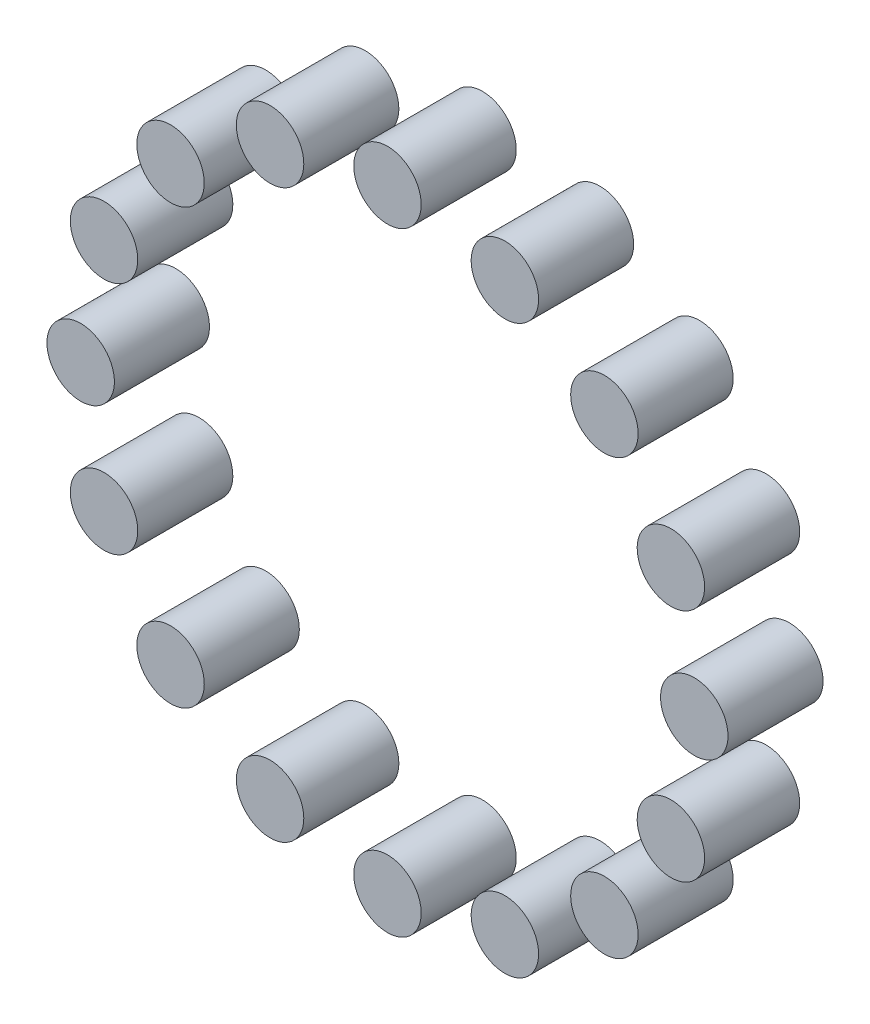
ISO-10303-21;
HEADER;
FILE_DESCRIPTION(('STEP AP214'),'2;1');
FILE_NAME('part.step','',(''),(''),'','','');
FILE_SCHEMA(('AUTOMOTIVE_DESIGN { 1 0 10303 214 1 1 1 1 }'));
ENDSEC;
DATA;
#1=APPLICATION_CONTEXT('core data for automotive mechanical design processes');
#2=APPLICATION_PROTOCOL_DEFINITION('international standard','automotive_design',2000,#1);
#3=PRODUCT_CONTEXT('',#1,'mechanical');
#4=PRODUCT('Part','Part','',(#3));
#5=PRODUCT_RELATED_PRODUCT_CATEGORY('part','',(#4));
#6=PRODUCT_DEFINITION_FORMATION('','',#4);
#7=PRODUCT_DEFINITION_CONTEXT('part definition',#1,'design');
#8=PRODUCT_DEFINITION('design','',#6,#7);
#9=PRODUCT_DEFINITION_SHAPE('','',#8);
#10=(LENGTH_UNIT() NAMED_UNIT(*) SI_UNIT(.MILLI.,.METRE.));
#11=(NAMED_UNIT(*) PLANE_ANGLE_UNIT() SI_UNIT($,.RADIAN.));
#12=(NAMED_UNIT(*) SI_UNIT($,.STERADIAN.) SOLID_ANGLE_UNIT());
#13=UNCERTAINTY_MEASURE_WITH_UNIT(LENGTH_MEASURE(1.E-05),#10,'distance_accuracy_value','');
#14=(GEOMETRIC_REPRESENTATION_CONTEXT(3) GLOBAL_UNCERTAINTY_ASSIGNED_CONTEXT((#13)) GLOBAL_UNIT_ASSIGNED_CONTEXT((#10,
#11,#12)) REPRESENTATION_CONTEXT('',''));
#15=CARTESIAN_POINT('',(0.,0.,0.));
#16=DIRECTION('',(0.,0.,1.));
#17=DIRECTION('',(1.,0.,0.));
#18=AXIS2_PLACEMENT_3D('',#15,#16,#17);
#19=CARTESIAN_POINT('',(29.8149783334382,-12.3497683875696,10.));
#20=DIRECTION('',(0.,0.,-1.));
#21=DIRECTION('',(-0.923879532511292,0.382683432365077,0.));
#22=AXIS2_PLACEMENT_3D('',#19,#20,#21);
#23=CYLINDRICAL_SURFACE('',#22,3.54796);
#24=CARTESIAN_POINT('',(29.8149783334382,-12.3497683875696,10.));
#25=DIRECTION('',(0.,0.,1.));
#26=DIRECTION('',(0.923879532511292,-0.382683432365077,0.));
#27=AXIS2_PLACEMENT_3D('',#24,#25,#26);
#28=CIRCLE('',#27,3.54796);
#29=CARTESIAN_POINT('',(33.0928659596069,-13.7075138982636,10.));
#30=VERTEX_POINT('',#29);
#31=EDGE_CURVE('E11',#30,#30,#28,.T.);
#32=ORIENTED_EDGE('',*,*,#31,.F.);
#33=EDGE_LOOP('',(#32));
#34=FACE_BOUND('',#33,.T.);
#35=CARTESIAN_POINT('',(29.8149783334382,-12.3497683875696,0.));
#36=DIRECTION('',(0.,0.,1.));
#37=DIRECTION('',(0.923879532511292,-0.382683432365077,0.));
#38=AXIS2_PLACEMENT_3D('',#35,#36,#37);
#39=CIRCLE('',#38,3.54796);
#40=CARTESIAN_POINT('',(33.0928659596069,-13.7075138982636,0.));
#41=VERTEX_POINT('',#40);
#42=EDGE_CURVE('E49',#41,#41,#39,.T.);
#43=ORIENTED_EDGE('',*,*,#42,.T.);
#44=EDGE_LOOP('',(#43));
#45=FACE_BOUND('',#44,.T.);
#46=ADVANCED_FACE('F46',(#34,#45),#23,.T.);
#47=CARTESIAN_POINT('',(29.8149783334382,-12.3497683875696,10.));
#48=DIRECTION('',(0.,0.,1.));
#49=DIRECTION('',(0.923879532511292,-0.382683432365077,0.));
#50=AXIS2_PLACEMENT_3D('',#47,#48,#49);
#51=PLANE('',#50);
#52=ORIENTED_EDGE('',*,*,#31,.T.);
#53=EDGE_LOOP('',(#52));
#54=FACE_BOUND('',#53,.T.);
#55=ADVANCED_FACE('F61',(#54),#51,.T.);
#56=CARTESIAN_POINT('',(29.8149783334382,-12.3497683875696,0.));
#57=DIRECTION('',(0.,0.,1.));
#58=DIRECTION('',(0.923879532511292,-0.382683432365077,0.));
#59=AXIS2_PLACEMENT_3D('',#56,#57,#58);
#60=PLANE('',#59);
#61=ORIENTED_EDGE('',*,*,#42,.F.);
#62=EDGE_LOOP('',(#61));
#63=FACE_BOUND('',#62,.T.);
#64=ADVANCED_FACE('F59',(#63),#60,.F.);
#65=CLOSED_SHELL('',(#46,#55,#64));
#66=MANIFOLD_SOLID_BREP('B2',#65);
#67=CARTESIAN_POINT('',(22.8193964890619,-22.8193964890614,10.));
#68=DIRECTION('',(0.,0.,-1.));
#69=DIRECTION('',(-0.707106781186556,0.707106781186539,0.));
#70=AXIS2_PLACEMENT_3D('',#67,#68,#69);
#71=CYLINDRICAL_SURFACE('',#70,3.54796);
#72=CARTESIAN_POINT('',(22.8193964890619,-22.8193964890614,10.));
#73=DIRECTION('',(0.,0.,1.));
#74=DIRECTION('',(0.707106781186556,-0.707106781186539,0.));
#75=AXIS2_PLACEMENT_3D('',#72,#73,#74);
#76=CIRCLE('',#75,3.54796);
#77=CARTESIAN_POINT('',(25.3281830644406,-25.32818306444,10.));
#78=VERTEX_POINT('',#77);
#79=EDGE_CURVE('E45',#78,#78,#76,.T.);
#80=ORIENTED_EDGE('',*,*,#79,.F.);
#81=EDGE_LOOP('',(#80));
#82=FACE_BOUND('',#81,.T.);
#83=CARTESIAN_POINT('',(22.8193964890619,-22.8193964890614,0.));
#84=DIRECTION('',(0.,0.,1.));
#85=DIRECTION('',(0.707106781186556,-0.707106781186539,0.));
#86=AXIS2_PLACEMENT_3D('',#83,#84,#85);
#87=CIRCLE('',#86,3.54796);
#88=CARTESIAN_POINT('',(25.3281830644406,-25.32818306444,0.));
#89=VERTEX_POINT('',#88);
#90=EDGE_CURVE('E104',#89,#89,#87,.T.);
#91=ORIENTED_EDGE('',*,*,#90,.T.);
#92=EDGE_LOOP('',(#91));
#93=FACE_BOUND('',#92,.T.);
#94=ADVANCED_FACE('F101',(#82,#93),#71,.T.);
#95=CARTESIAN_POINT('',(22.8193964890619,-22.8193964890614,10.));
#96=DIRECTION('',(0.,0.,1.));
#97=DIRECTION('',(0.707106781186556,-0.707106781186539,0.));
#98=AXIS2_PLACEMENT_3D('',#95,#96,#97);
#99=PLANE('',#98);
#100=ORIENTED_EDGE('',*,*,#79,.T.);
#101=EDGE_LOOP('',(#100));
#102=FACE_BOUND('',#101,.T.);
#103=ADVANCED_FACE('F116',(#102),#99,.T.);
#104=CARTESIAN_POINT('',(22.8193964890619,-22.8193964890614,0.));
#105=DIRECTION('',(0.,0.,1.));
#106=DIRECTION('',(0.707106781186556,-0.707106781186539,0.));
#107=AXIS2_PLACEMENT_3D('',#104,#105,#106);
#108=PLANE('',#107);
#109=ORIENTED_EDGE('',*,*,#90,.F.);
#110=EDGE_LOOP('',(#109));
#111=FACE_BOUND('',#110,.T.);
#112=ADVANCED_FACE('F114',(#111),#108,.F.);
#113=CLOSED_SHELL('',(#94,#103,#112));
#114=MANIFOLD_SOLID_BREP('B6',#113);
#115=CARTESIAN_POINT('',(12.3497683875703,-29.8149783334379,10.));
#116=DIRECTION('',(0.,0.,-1.));
#117=DIRECTION('',(-0.3826834323651,0.923879532511283,0.));
#118=AXIS2_PLACEMENT_3D('',#115,#116,#117);
#119=CYLINDRICAL_SURFACE('',#118,3.54796);
#120=CARTESIAN_POINT('',(12.3497683875703,-29.8149783334379,10.));
#121=DIRECTION('',(0.,0.,1.));
#122=DIRECTION('',(0.3826834323651,-0.923879532511283,0.));
#123=AXIS2_PLACEMENT_3D('',#120,#121,#122);
#124=CIRCLE('',#123,3.54796);
#125=CARTESIAN_POINT('',(13.7075138982644,-33.0928659596066,10.));
#126=VERTEX_POINT('',#125);
#127=EDGE_CURVE('E100',#126,#126,#124,.T.);
#128=ORIENTED_EDGE('',*,*,#127,.F.);
#129=EDGE_LOOP('',(#128));
#130=FACE_BOUND('',#129,.T.);
#131=CARTESIAN_POINT('',(12.3497683875703,-29.8149783334379,0.));
#132=DIRECTION('',(0.,0.,1.));
#133=DIRECTION('',(0.3826834323651,-0.923879532511283,0.));
#134=AXIS2_PLACEMENT_3D('',#131,#132,#133);
#135=CIRCLE('',#134,3.54796);
#136=CARTESIAN_POINT('',(13.7075138982644,-33.0928659596066,0.));
#137=VERTEX_POINT('',#136);
#138=EDGE_CURVE('E159',#137,#137,#135,.T.);
#139=ORIENTED_EDGE('',*,*,#138,.T.);
#140=EDGE_LOOP('',(#139));
#141=FACE_BOUND('',#140,.T.);
#142=ADVANCED_FACE('F156',(#130,#141),#119,.T.);
#143=CARTESIAN_POINT('',(12.3497683875703,-29.8149783334379,10.));
#144=DIRECTION('',(0.,0.,1.));
#145=DIRECTION('',(0.3826834323651,-0.923879532511283,0.));
#146=AXIS2_PLACEMENT_3D('',#143,#144,#145);
#147=PLANE('',#146);
#148=ORIENTED_EDGE('',*,*,#127,.T.);
#149=EDGE_LOOP('',(#148));
#150=FACE_BOUND('',#149,.T.);
#151=ADVANCED_FACE('F171',(#150),#147,.T.);
#152=CARTESIAN_POINT('',(12.3497683875703,-29.8149783334379,0.));
#153=DIRECTION('',(0.,0.,1.));
#154=DIRECTION('',(0.3826834323651,-0.923879532511283,0.));
#155=AXIS2_PLACEMENT_3D('',#152,#153,#154);
#156=PLANE('',#155);
#157=ORIENTED_EDGE('',*,*,#138,.F.);
#158=EDGE_LOOP('',(#157));
#159=FACE_BOUND('',#158,.T.);
#160=ADVANCED_FACE('F169',(#159),#156,.F.);
#161=CLOSED_SHELL('',(#142,#151,#160));
#162=MANIFOLD_SOLID_BREP('B40',#161);
#163=CARTESIAN_POINT('',(3.38026020079429E-13,-32.2715,10.));
#164=DIRECTION('',(0.,0.,-1.));
#165=DIRECTION('',(0.,1.,0.));
#166=AXIS2_PLACEMENT_3D('',#163,#164,#165);
#167=CYLINDRICAL_SURFACE('',#166,3.54796);
#168=CARTESIAN_POINT('',(3.38026020079429E-13,-32.2715,10.));
#169=DIRECTION('',(0.,0.,1.));
#170=DIRECTION('',(0.,-1.,0.));
#171=AXIS2_PLACEMENT_3D('',#168,#169,#170);
#172=CIRCLE('',#171,3.54796);
#173=CARTESIAN_POINT('',(3.75188928472314E-13,-35.81946,10.));
#174=VERTEX_POINT('',#173);
#175=EDGE_CURVE('E155',#174,#174,#172,.T.);
#176=ORIENTED_EDGE('',*,*,#175,.F.);
#177=EDGE_LOOP('',(#176));
#178=FACE_BOUND('',#177,.T.);
#179=CARTESIAN_POINT('',(3.38026020079429E-13,-32.2715,0.));
#180=DIRECTION('',(0.,0.,1.));
#181=DIRECTION('',(0.,-1.,0.));
#182=AXIS2_PLACEMENT_3D('',#179,#180,#181);
#183=CIRCLE('',#182,3.54796);
#184=CARTESIAN_POINT('',(3.75188928472314E-13,-35.81946,0.));
#185=VERTEX_POINT('',#184);
#186=EDGE_CURVE('E214',#185,#185,#183,.T.);
#187=ORIENTED_EDGE('',*,*,#186,.T.);
#188=EDGE_LOOP('',(#187));
#189=FACE_BOUND('',#188,.T.);
#190=ADVANCED_FACE('F211',(#178,#189),#167,.T.);
#191=CARTESIAN_POINT('',(3.38026020079429E-13,-32.2715,10.));
#192=DIRECTION('',(0.,0.,1.));
#193=DIRECTION('',(0.,-1.,0.));
#194=AXIS2_PLACEMENT_3D('',#191,#192,#193);
#195=PLANE('',#194);
#196=ORIENTED_EDGE('',*,*,#175,.T.);
#197=EDGE_LOOP('',(#196));
#198=FACE_BOUND('',#197,.T.);
#199=ADVANCED_FACE('F226',(#198),#195,.T.);
#200=CARTESIAN_POINT('',(3.38026020079429E-13,-32.2715,0.));
#201=DIRECTION('',(0.,0.,1.));
#202=DIRECTION('',(0.,-1.,0.));
#203=AXIS2_PLACEMENT_3D('',#200,#201,#202);
#204=PLANE('',#203);
#205=ORIENTED_EDGE('',*,*,#186,.F.);
#206=EDGE_LOOP('',(#205));
#207=FACE_BOUND('',#206,.T.);
#208=ADVANCED_FACE('F224',(#207),#204,.F.);
#209=CLOSED_SHELL('',(#190,#199,#208));
#210=MANIFOLD_SOLID_BREP('B95',#209);
#211=CARTESIAN_POINT('',(-12.3497683875697,-29.8149783334381,10.));
#212=DIRECTION('',(0.,0.,-1.));
#213=DIRECTION('',(0.382683432365081,0.923879532511291,0.));
#214=AXIS2_PLACEMENT_3D('',#211,#212,#213);
#215=CYLINDRICAL_SURFACE('',#214,3.54796);
#216=CARTESIAN_POINT('',(-12.3497683875697,-29.8149783334381,10.));
#217=DIRECTION('',(0.,0.,1.));
#218=DIRECTION('',(-0.382683432365081,-0.923879532511291,0.));
#219=AXIS2_PLACEMENT_3D('',#216,#217,#218);
#220=CIRCLE('',#219,3.54796);
#221=CARTESIAN_POINT('',(-13.7075138982637,-33.0928659596069,10.));
#222=VERTEX_POINT('',#221);
#223=EDGE_CURVE('E210',#222,#222,#220,.T.);
#224=ORIENTED_EDGE('',*,*,#223,.F.);
#225=EDGE_LOOP('',(#224));
#226=FACE_BOUND('',#225,.T.);
#227=CARTESIAN_POINT('',(-12.3497683875697,-29.8149783334381,0.));
#228=DIRECTION('',(0.,0.,1.));
#229=DIRECTION('',(-0.382683432365081,-0.923879532511291,0.));
#230=AXIS2_PLACEMENT_3D('',#227,#228,#229);
#231=CIRCLE('',#230,3.54796);
#232=CARTESIAN_POINT('',(-13.7075138982637,-33.0928659596069,0.));
#233=VERTEX_POINT('',#232);
#234=EDGE_CURVE('E269',#233,#233,#231,.T.);
#235=ORIENTED_EDGE('',*,*,#234,.T.);
#236=EDGE_LOOP('',(#235));
#237=FACE_BOUND('',#236,.T.);
#238=ADVANCED_FACE('F266',(#226,#237),#215,.T.);
#239=CARTESIAN_POINT('',(-12.3497683875697,-29.8149783334381,10.));
#240=DIRECTION('',(0.,0.,1.));
#241=DIRECTION('',(-0.382683432365081,-0.923879532511291,0.));
#242=AXIS2_PLACEMENT_3D('',#239,#240,#241);
#243=PLANE('',#242);
#244=ORIENTED_EDGE('',*,*,#223,.T.);
#245=EDGE_LOOP('',(#244));
#246=FACE_BOUND('',#245,.T.);
#247=ADVANCED_FACE('F281',(#246),#243,.T.);
#248=CARTESIAN_POINT('',(-12.3497683875697,-29.8149783334381,0.));
#249=DIRECTION('',(0.,0.,1.));
#250=DIRECTION('',(-0.382683432365081,-0.923879532511291,0.));
#251=AXIS2_PLACEMENT_3D('',#248,#249,#250);
#252=PLANE('',#251);
#253=ORIENTED_EDGE('',*,*,#234,.F.);
#254=EDGE_LOOP('',(#253));
#255=FACE_BOUND('',#254,.T.);
#256=ADVANCED_FACE('F279',(#255),#252,.F.);
#257=CLOSED_SHELL('',(#238,#247,#256));
#258=MANIFOLD_SOLID_BREP('B150',#257);
#259=CARTESIAN_POINT('',(-22.8193964890615,-22.8193964890619,10.));
#260=DIRECTION('',(0.,0.,-1.));
#261=DIRECTION('',(0.707106781186541,0.707106781186554,0.));
#262=AXIS2_PLACEMENT_3D('',#259,#260,#261);
#263=CYLINDRICAL_SURFACE('',#262,3.54796);
#264=CARTESIAN_POINT('',(-22.8193964890615,-22.8193964890619,10.));
#265=DIRECTION('',(0.,0.,1.));
#266=DIRECTION('',(-0.707106781186541,-0.707106781186554,0.));
#267=AXIS2_PLACEMENT_3D('',#264,#265,#266);
#268=CIRCLE('',#267,3.54796);
#269=CARTESIAN_POINT('',(-25.3281830644401,-25.3281830644405,10.));
#270=VERTEX_POINT('',#269);
#271=EDGE_CURVE('E265',#270,#270,#268,.T.);
#272=ORIENTED_EDGE('',*,*,#271,.F.);
#273=EDGE_LOOP('',(#272));
#274=FACE_BOUND('',#273,.T.);
#275=CARTESIAN_POINT('',(-22.8193964890615,-22.8193964890619,0.));
#276=DIRECTION('',(0.,0.,1.));
#277=DIRECTION('',(-0.707106781186541,-0.707106781186554,0.));
#278=AXIS2_PLACEMENT_3D('',#275,#276,#277);
#279=CIRCLE('',#278,3.54796);
#280=CARTESIAN_POINT('',(-25.3281830644401,-25.3281830644405,0.));
#281=VERTEX_POINT('',#280);
#282=EDGE_CURVE('E324',#281,#281,#279,.T.);
#283=ORIENTED_EDGE('',*,*,#282,.T.);
#284=EDGE_LOOP('',(#283));
#285=FACE_BOUND('',#284,.T.);
#286=ADVANCED_FACE('F321',(#274,#285),#263,.T.);
#287=CARTESIAN_POINT('',(-22.8193964890615,-22.8193964890619,10.));
#288=DIRECTION('',(0.,0.,1.));
#289=DIRECTION('',(-0.707106781186541,-0.707106781186554,0.));
#290=AXIS2_PLACEMENT_3D('',#287,#288,#289);
#291=PLANE('',#290);
#292=ORIENTED_EDGE('',*,*,#271,.T.);
#293=EDGE_LOOP('',(#292));
#294=FACE_BOUND('',#293,.T.);
#295=ADVANCED_FACE('F336',(#294),#291,.T.);
#296=CARTESIAN_POINT('',(-22.8193964890615,-22.8193964890619,0.));
#297=DIRECTION('',(0.,0.,1.));
#298=DIRECTION('',(-0.707106781186541,-0.707106781186554,0.));
#299=AXIS2_PLACEMENT_3D('',#296,#297,#298);
#300=PLANE('',#299);
#301=ORIENTED_EDGE('',*,*,#282,.F.);
#302=EDGE_LOOP('',(#301));
#303=FACE_BOUND('',#302,.T.);
#304=ADVANCED_FACE('F334',(#303),#300,.F.);
#305=CLOSED_SHELL('',(#286,#295,#304));
#306=MANIFOLD_SOLID_BREP('B205',#305);
#307=CARTESIAN_POINT('',(-29.8149783334379,-12.3497683875702,10.));
#308=DIRECTION('',(0.,0.,-1.));
#309=DIRECTION('',(0.923879532511284,0.382683432365097,0.));
#310=AXIS2_PLACEMENT_3D('',#307,#308,#309);
#311=CYLINDRICAL_SURFACE('',#310,3.54796);
#312=CARTESIAN_POINT('',(-29.8149783334379,-12.3497683875702,10.));
#313=DIRECTION('',(0.,0.,1.));
#314=DIRECTION('',(-0.923879532511284,-0.382683432365097,0.));
#315=AXIS2_PLACEMENT_3D('',#312,#313,#314);
#316=CIRCLE('',#315,3.54796);
#317=CARTESIAN_POINT('',(-33.0928659596066,-13.7075138982643,10.));
#318=VERTEX_POINT('',#317);
#319=EDGE_CURVE('E320',#318,#318,#316,.T.);
#320=ORIENTED_EDGE('',*,*,#319,.F.);
#321=EDGE_LOOP('',(#320));
#322=FACE_BOUND('',#321,.T.);
#323=CARTESIAN_POINT('',(-29.8149783334379,-12.3497683875702,0.));
#324=DIRECTION('',(0.,0.,1.));
#325=DIRECTION('',(-0.923879532511284,-0.382683432365097,0.));
#326=AXIS2_PLACEMENT_3D('',#323,#324,#325);
#327=CIRCLE('',#326,3.54796);
#328=CARTESIAN_POINT('',(-33.0928659596066,-13.7075138982643,0.));
#329=VERTEX_POINT('',#328);
#330=EDGE_CURVE('E379',#329,#329,#327,.T.);
#331=ORIENTED_EDGE('',*,*,#330,.T.);
#332=EDGE_LOOP('',(#331));
#333=FACE_BOUND('',#332,.T.);
#334=ADVANCED_FACE('F376',(#322,#333),#311,.T.);
#335=CARTESIAN_POINT('',(-29.8149783334379,-12.3497683875702,10.));
#336=DIRECTION('',(0.,0.,1.));
#337=DIRECTION('',(-0.923879532511284,-0.382683432365097,0.));
#338=AXIS2_PLACEMENT_3D('',#335,#336,#337);
#339=PLANE('',#338);
#340=ORIENTED_EDGE('',*,*,#319,.T.);
#341=EDGE_LOOP('',(#340));
#342=FACE_BOUND('',#341,.T.);
#343=ADVANCED_FACE('F391',(#342),#339,.T.);
#344=CARTESIAN_POINT('',(-29.8149783334379,-12.3497683875702,0.));
#345=DIRECTION('',(0.,0.,1.));
#346=DIRECTION('',(-0.923879532511284,-0.382683432365097,0.));
#347=AXIS2_PLACEMENT_3D('',#344,#345,#346);
#348=PLANE('',#347);
#349=ORIENTED_EDGE('',*,*,#330,.F.);
#350=EDGE_LOOP('',(#349));
#351=FACE_BOUND('',#350,.T.);
#352=ADVANCED_FACE('F389',(#351),#348,.F.);
#353=CLOSED_SHELL('',(#334,#343,#352));
#354=MANIFOLD_SOLID_BREP('B260',#353);
#355=CARTESIAN_POINT('',(-32.2715,0.,10.));
#356=DIRECTION('',(0.,0.,-1.));
#357=DIRECTION('',(1.,0.,0.));
#358=AXIS2_PLACEMENT_3D('',#355,#356,#357);
#359=CYLINDRICAL_SURFACE('',#358,3.54796);
#360=CARTESIAN_POINT('',(-32.2715,0.,10.));
#361=DIRECTION('',(0.,0.,1.));
#362=DIRECTION('',(-1.,0.,0.));
#363=AXIS2_PLACEMENT_3D('',#360,#361,#362);
#364=CIRCLE('',#363,3.54796);
#365=CARTESIAN_POINT('',(-35.81946,0.,10.));
#366=VERTEX_POINT('',#365);
#367=EDGE_CURVE('E375',#366,#366,#364,.T.);
#368=ORIENTED_EDGE('',*,*,#367,.F.);
#369=EDGE_LOOP('',(#368));
#370=FACE_BOUND('',#369,.T.);
#371=CARTESIAN_POINT('',(-32.2715,0.,0.));
#372=DIRECTION('',(0.,0.,1.));
#373=DIRECTION('',(-1.,0.,0.));
#374=AXIS2_PLACEMENT_3D('',#371,#372,#373);
#375=CIRCLE('',#374,3.54796);
#376=CARTESIAN_POINT('',(-35.81946,0.,0.));
#377=VERTEX_POINT('',#376);
#378=EDGE_CURVE('E434',#377,#377,#375,.T.);
#379=ORIENTED_EDGE('',*,*,#378,.T.);
#380=EDGE_LOOP('',(#379));
#381=FACE_BOUND('',#380,.T.);
#382=ADVANCED_FACE('F431',(#370,#381),#359,.T.);
#383=CARTESIAN_POINT('',(-32.2715,0.,10.));
#384=DIRECTION('',(0.,0.,1.));
#385=DIRECTION('',(-1.,0.,0.));
#386=AXIS2_PLACEMENT_3D('',#383,#384,#385);
#387=PLANE('',#386);
#388=ORIENTED_EDGE('',*,*,#367,.T.);
#389=EDGE_LOOP('',(#388));
#390=FACE_BOUND('',#389,.T.);
#391=ADVANCED_FACE('F446',(#390),#387,.T.);
#392=CARTESIAN_POINT('',(-32.2715,0.,0.));
#393=DIRECTION('',(0.,0.,1.));
#394=DIRECTION('',(-1.,0.,0.));
#395=AXIS2_PLACEMENT_3D('',#392,#393,#394);
#396=PLANE('',#395);
#397=ORIENTED_EDGE('',*,*,#378,.F.);
#398=EDGE_LOOP('',(#397));
#399=FACE_BOUND('',#398,.T.);
#400=ADVANCED_FACE('F444',(#399),#396,.F.);
#401=CLOSED_SHELL('',(#382,#391,#400));
#402=MANIFOLD_SOLID_BREP('B315',#401);
#403=CARTESIAN_POINT('',(-29.8149783334381,12.3497683875698,10.));
#404=DIRECTION('',(0.,0.,-1.));
#405=DIRECTION('',(0.923879532511289,-0.382683432365084,0.));
#406=AXIS2_PLACEMENT_3D('',#403,#404,#405);
#407=CYLINDRICAL_SURFACE('',#406,3.54796);
#408=CARTESIAN_POINT('',(-29.8149783334381,12.3497683875698,10.));
#409=DIRECTION('',(0.,0.,1.));
#410=DIRECTION('',(-0.923879532511289,0.382683432365084,0.));
#411=AXIS2_PLACEMENT_3D('',#408,#409,#410);
#412=CIRCLE('',#411,3.54796);
#413=CARTESIAN_POINT('',(-33.0928659596068,13.7075138982638,10.));
#414=VERTEX_POINT('',#413);
#415=EDGE_CURVE('E430',#414,#414,#412,.T.);
#416=ORIENTED_EDGE('',*,*,#415,.F.);
#417=EDGE_LOOP('',(#416));
#418=FACE_BOUND('',#417,.T.);
#419=CARTESIAN_POINT('',(-29.8149783334381,12.3497683875698,0.));
#420=DIRECTION('',(0.,0.,1.));
#421=DIRECTION('',(-0.923879532511289,0.382683432365084,0.));
#422=AXIS2_PLACEMENT_3D('',#419,#420,#421);
#423=CIRCLE('',#422,3.54796);
#424=CARTESIAN_POINT('',(-33.0928659596068,13.7075138982638,0.));
#425=VERTEX_POINT('',#424);
#426=EDGE_CURVE('E489',#425,#425,#423,.T.);
#427=ORIENTED_EDGE('',*,*,#426,.T.);
#428=EDGE_LOOP('',(#427));
#429=FACE_BOUND('',#428,.T.);
#430=ADVANCED_FACE('F486',(#418,#429),#407,.T.);
#431=CARTESIAN_POINT('',(-29.8149783334381,12.3497683875698,10.));
#432=DIRECTION('',(0.,0.,1.));
#433=DIRECTION('',(-0.923879532511289,0.382683432365084,0.));
#434=AXIS2_PLACEMENT_3D('',#431,#432,#433);
#435=PLANE('',#434);
#436=ORIENTED_EDGE('',*,*,#415,.T.);
#437=EDGE_LOOP('',(#436));
#438=FACE_BOUND('',#437,.T.);
#439=ADVANCED_FACE('F501',(#438),#435,.T.);
#440=CARTESIAN_POINT('',(-29.8149783334381,12.3497683875698,0.));
#441=DIRECTION('',(0.,0.,1.));
#442=DIRECTION('',(-0.923879532511289,0.382683432365084,0.));
#443=AXIS2_PLACEMENT_3D('',#440,#441,#442);
#444=PLANE('',#443);
#445=ORIENTED_EDGE('',*,*,#426,.F.);
#446=EDGE_LOOP('',(#445));
#447=FACE_BOUND('',#446,.T.);
#448=ADVANCED_FACE('F499',(#447),#444,.F.);
#449=CLOSED_SHELL('',(#430,#439,#448));
#450=MANIFOLD_SOLID_BREP('B370',#449);
#451=CARTESIAN_POINT('',(-22.8193964890618,22.8193964890615,10.));
#452=DIRECTION('',(0.,0.,-1.));
#453=DIRECTION('',(0.707106781186551,-0.707106781186544,0.));
#454=AXIS2_PLACEMENT_3D('',#451,#452,#453);
#455=CYLINDRICAL_SURFACE('',#454,3.54796);
#456=CARTESIAN_POINT('',(-22.8193964890618,22.8193964890615,10.));
#457=DIRECTION('',(0.,0.,1.));
#458=DIRECTION('',(-0.707106781186551,0.707106781186544,0.));
#459=AXIS2_PLACEMENT_3D('',#456,#457,#458);
#460=CIRCLE('',#459,3.54796);
#461=CARTESIAN_POINT('',(-25.3281830644404,25.3281830644402,10.));
#462=VERTEX_POINT('',#461);
#463=EDGE_CURVE('E485',#462,#462,#460,.T.);
#464=ORIENTED_EDGE('',*,*,#463,.F.);
#465=EDGE_LOOP('',(#464));
#466=FACE_BOUND('',#465,.T.);
#467=CARTESIAN_POINT('',(-22.8193964890618,22.8193964890615,0.));
#468=DIRECTION('',(0.,0.,1.));
#469=DIRECTION('',(-0.707106781186551,0.707106781186544,0.));
#470=AXIS2_PLACEMENT_3D('',#467,#468,#469);
#471=CIRCLE('',#470,3.54796);
#472=CARTESIAN_POINT('',(-25.3281830644404,25.3281830644402,0.));
#473=VERTEX_POINT('',#472);
#474=EDGE_CURVE('E544',#473,#473,#471,.T.);
#475=ORIENTED_EDGE('',*,*,#474,.T.);
#476=EDGE_LOOP('',(#475));
#477=FACE_BOUND('',#476,.T.);
#478=ADVANCED_FACE('F541',(#466,#477),#455,.T.);
#479=CARTESIAN_POINT('',(-22.8193964890618,22.8193964890615,10.));
#480=DIRECTION('',(0.,0.,1.));
#481=DIRECTION('',(-0.707106781186551,0.707106781186544,0.));
#482=AXIS2_PLACEMENT_3D('',#479,#480,#481);
#483=PLANE('',#482);
#484=ORIENTED_EDGE('',*,*,#463,.T.);
#485=EDGE_LOOP('',(#484));
#486=FACE_BOUND('',#485,.T.);
#487=ADVANCED_FACE('F556',(#486),#483,.T.);
#488=CARTESIAN_POINT('',(-22.8193964890618,22.8193964890615,0.));
#489=DIRECTION('',(0.,0.,1.));
#490=DIRECTION('',(-0.707106781186551,0.707106781186544,0.));
#491=AXIS2_PLACEMENT_3D('',#488,#489,#490);
#492=PLANE('',#491);
#493=ORIENTED_EDGE('',*,*,#474,.F.);
#494=EDGE_LOOP('',(#493));
#495=FACE_BOUND('',#494,.T.);
#496=ADVANCED_FACE('F554',(#495),#492,.F.);
#497=CLOSED_SHELL('',(#478,#487,#496));
#498=MANIFOLD_SOLID_BREP('B425',#497);
#499=CARTESIAN_POINT('',(-12.3497683875701,29.8149783334379,10.));
#500=DIRECTION('',(0.,0.,-1.));
#501=DIRECTION('',(0.382683432365094,-0.923879532511285,0.));
#502=AXIS2_PLACEMENT_3D('',#499,#500,#501);
#503=CYLINDRICAL_SURFACE('',#502,3.54796);
#504=CARTESIAN_POINT('',(-12.3497683875701,29.8149783334379,10.));
#505=DIRECTION('',(0.,0.,1.));
#506=DIRECTION('',(-0.382683432365094,0.923879532511285,0.));
#507=AXIS2_PLACEMENT_3D('',#504,#505,#506);
#508=CIRCLE('',#507,3.54796);
#509=CARTESIAN_POINT('',(-13.7075138982642,33.0928659596067,10.));
#510=VERTEX_POINT('',#509);
#511=EDGE_CURVE('E540',#510,#510,#508,.T.);
#512=ORIENTED_EDGE('',*,*,#511,.F.);
#513=EDGE_LOOP('',(#512));
#514=FACE_BOUND('',#513,.T.);
#515=CARTESIAN_POINT('',(-12.3497683875701,29.8149783334379,0.));
#516=DIRECTION('',(0.,0.,1.));
#517=DIRECTION('',(-0.382683432365094,0.923879532511285,0.));
#518=AXIS2_PLACEMENT_3D('',#515,#516,#517);
#519=CIRCLE('',#518,3.54796);
#520=CARTESIAN_POINT('',(-13.7075138982642,33.0928659596067,0.));
#521=VERTEX_POINT('',#520);
#522=EDGE_CURVE('E599',#521,#521,#519,.T.);
#523=ORIENTED_EDGE('',*,*,#522,.T.);
#524=EDGE_LOOP('',(#523));
#525=FACE_BOUND('',#524,.T.);
#526=ADVANCED_FACE('F596',(#514,#525),#503,.T.);
#527=CARTESIAN_POINT('',(-12.3497683875701,29.8149783334379,10.));
#528=DIRECTION('',(0.,0.,1.));
#529=DIRECTION('',(-0.382683432365094,0.923879532511285,0.));
#530=AXIS2_PLACEMENT_3D('',#527,#528,#529);
#531=PLANE('',#530);
#532=ORIENTED_EDGE('',*,*,#511,.T.);
#533=EDGE_LOOP('',(#532));
#534=FACE_BOUND('',#533,.T.);
#535=ADVANCED_FACE('F611',(#534),#531,.T.);
#536=CARTESIAN_POINT('',(-12.3497683875701,29.8149783334379,0.));
#537=DIRECTION('',(0.,0.,1.));
#538=DIRECTION('',(-0.382683432365094,0.923879532511285,0.));
#539=AXIS2_PLACEMENT_3D('',#536,#537,#538);
#540=PLANE('',#539);
#541=ORIENTED_EDGE('',*,*,#522,.F.);
#542=EDGE_LOOP('',(#541));
#543=FACE_BOUND('',#542,.T.);
#544=ADVANCED_FACE('F609',(#543),#540,.F.);
#545=CLOSED_SHELL('',(#526,#535,#544));
#546=MANIFOLD_SOLID_BREP('B480',#545);
#547=CARTESIAN_POINT('',(-1.12675340026476E-13,32.2715,10.));
#548=DIRECTION('',(0.,0.,-1.));
#549=DIRECTION('',(0.,-1.,0.));
#550=AXIS2_PLACEMENT_3D('',#547,#548,#549);
#551=CYLINDRICAL_SURFACE('',#550,3.54796);
#552=CARTESIAN_POINT('',(-1.12675340026476E-13,32.2715,10.));
#553=DIRECTION('',(0.,0.,1.));
#554=DIRECTION('',(0.,1.,0.));
#555=AXIS2_PLACEMENT_3D('',#552,#553,#554);
#556=CIRCLE('',#555,3.54796);
#557=CARTESIAN_POINT('',(-1.25062976157438E-13,35.81946,10.));
#558=VERTEX_POINT('',#557);
#559=EDGE_CURVE('E595',#558,#558,#556,.T.);
#560=ORIENTED_EDGE('',*,*,#559,.F.);
#561=EDGE_LOOP('',(#560));
#562=FACE_BOUND('',#561,.T.);
#563=CARTESIAN_POINT('',(-1.12675340026476E-13,32.2715,0.));
#564=DIRECTION('',(0.,0.,1.));
#565=DIRECTION('',(0.,1.,0.));
#566=AXIS2_PLACEMENT_3D('',#563,#564,#565);
#567=CIRCLE('',#566,3.54796);
#568=CARTESIAN_POINT('',(-1.25062976157438E-13,35.81946,0.));
#569=VERTEX_POINT('',#568);
#570=EDGE_CURVE('E654',#569,#569,#567,.T.);
#571=ORIENTED_EDGE('',*,*,#570,.T.);
#572=EDGE_LOOP('',(#571));
#573=FACE_BOUND('',#572,.T.);
#574=ADVANCED_FACE('F651',(#562,#573),#551,.T.);
#575=CARTESIAN_POINT('',(-1.12675340026476E-13,32.2715,10.));
#576=DIRECTION('',(0.,0.,1.));
#577=DIRECTION('',(0.,1.,0.));
#578=AXIS2_PLACEMENT_3D('',#575,#576,#577);
#579=PLANE('',#578);
#580=ORIENTED_EDGE('',*,*,#559,.T.);
#581=EDGE_LOOP('',(#580));
#582=FACE_BOUND('',#581,.T.);
#583=ADVANCED_FACE('F666',(#582),#579,.T.);
#584=CARTESIAN_POINT('',(-1.12675340026476E-13,32.2715,0.));
#585=DIRECTION('',(0.,0.,1.));
#586=DIRECTION('',(0.,1.,0.));
#587=AXIS2_PLACEMENT_3D('',#584,#585,#586);
#588=PLANE('',#587);
#589=ORIENTED_EDGE('',*,*,#570,.F.);
#590=EDGE_LOOP('',(#589));
#591=FACE_BOUND('',#590,.T.);
#592=ADVANCED_FACE('F664',(#591),#588,.F.);
#593=CLOSED_SHELL('',(#574,#583,#592));
#594=MANIFOLD_SOLID_BREP('B535',#593);
#595=CARTESIAN_POINT('',(12.3497683875699,29.814978333438,10.));
#596=DIRECTION('',(0.,0.,-1.));
#597=DIRECTION('',(-0.382683432365087,-0.923879532511288,0.));
#598=AXIS2_PLACEMENT_3D('',#595,#596,#597);
#599=CYLINDRICAL_SURFACE('',#598,3.54796);
#600=CARTESIAN_POINT('',(12.3497683875699,29.814978333438,10.));
#601=DIRECTION('',(0.,0.,1.));
#602=DIRECTION('',(0.382683432365087,0.923879532511288,0.));
#603=AXIS2_PLACEMENT_3D('',#600,#601,#602);
#604=CIRCLE('',#603,3.54796);
#605=CARTESIAN_POINT('',(13.707513898264,33.0928659596068,10.));
#606=VERTEX_POINT('',#605);
#607=EDGE_CURVE('E650',#606,#606,#604,.T.);
#608=ORIENTED_EDGE('',*,*,#607,.F.);
#609=EDGE_LOOP('',(#608));
#610=FACE_BOUND('',#609,.T.);
#611=CARTESIAN_POINT('',(12.3497683875699,29.814978333438,0.));
#612=DIRECTION('',(0.,0.,1.));
#613=DIRECTION('',(0.382683432365087,0.923879532511288,0.));
#614=AXIS2_PLACEMENT_3D('',#611,#612,#613);
#615=CIRCLE('',#614,3.54796);
#616=CARTESIAN_POINT('',(13.707513898264,33.0928659596068,0.));
#617=VERTEX_POINT('',#616);
#618=EDGE_CURVE('E709',#617,#617,#615,.T.);
#619=ORIENTED_EDGE('',*,*,#618,.T.);
#620=EDGE_LOOP('',(#619));
#621=FACE_BOUND('',#620,.T.);
#622=ADVANCED_FACE('F706',(#610,#621),#599,.T.);
#623=CARTESIAN_POINT('',(12.3497683875699,29.814978333438,10.));
#624=DIRECTION('',(0.,0.,1.));
#625=DIRECTION('',(0.382683432365087,0.923879532511288,0.));
#626=AXIS2_PLACEMENT_3D('',#623,#624,#625);
#627=PLANE('',#626);
#628=ORIENTED_EDGE('',*,*,#607,.T.);
#629=EDGE_LOOP('',(#628));
#630=FACE_BOUND('',#629,.T.);
#631=ADVANCED_FACE('F721',(#630),#627,.T.);
#632=CARTESIAN_POINT('',(12.3497683875699,29.814978333438,0.));
#633=DIRECTION('',(0.,0.,1.));
#634=DIRECTION('',(0.382683432365087,0.923879532511288,0.));
#635=AXIS2_PLACEMENT_3D('',#632,#633,#634);
#636=PLANE('',#635);
#637=ORIENTED_EDGE('',*,*,#618,.F.);
#638=EDGE_LOOP('',(#637));
#639=FACE_BOUND('',#638,.T.);
#640=ADVANCED_FACE('F719',(#639),#636,.F.);
#641=CLOSED_SHELL('',(#622,#631,#640));
#642=MANIFOLD_SOLID_BREP('B590',#641);
#643=CARTESIAN_POINT('',(22.8193964890616,22.8193964890617,10.));
#644=DIRECTION('',(0.,0.,-1.));
#645=DIRECTION('',(-0.707106781186546,-0.707106781186549,0.));
#646=AXIS2_PLACEMENT_3D('',#643,#644,#645);
#647=CYLINDRICAL_SURFACE('',#646,3.54796);
#648=CARTESIAN_POINT('',(22.8193964890616,22.8193964890617,10.));
#649=DIRECTION('',(0.,0.,1.));
#650=DIRECTION('',(0.707106781186546,0.707106781186549,0.));
#651=AXIS2_PLACEMENT_3D('',#648,#649,#650);
#652=CIRCLE('',#651,3.54796);
#653=CARTESIAN_POINT('',(25.3281830644402,25.3281830644403,10.));
#654=VERTEX_POINT('',#653);
#655=EDGE_CURVE('E705',#654,#654,#652,.T.);
#656=ORIENTED_EDGE('',*,*,#655,.F.);
#657=EDGE_LOOP('',(#656));
#658=FACE_BOUND('',#657,.T.);
#659=CARTESIAN_POINT('',(22.8193964890616,22.8193964890617,0.));
#660=DIRECTION('',(0.,0.,1.));
#661=DIRECTION('',(0.707106781186546,0.707106781186549,0.));
#662=AXIS2_PLACEMENT_3D('',#659,#660,#661);
#663=CIRCLE('',#662,3.54796);
#664=CARTESIAN_POINT('',(25.3281830644402,25.3281830644403,0.));
#665=VERTEX_POINT('',#664);
#666=EDGE_CURVE('E764',#665,#665,#663,.T.);
#667=ORIENTED_EDGE('',*,*,#666,.T.);
#668=EDGE_LOOP('',(#667));
#669=FACE_BOUND('',#668,.T.);
#670=ADVANCED_FACE('F761',(#658,#669),#647,.T.);
#671=CARTESIAN_POINT('',(22.8193964890616,22.8193964890617,10.));
#672=DIRECTION('',(0.,0.,1.));
#673=DIRECTION('',(0.707106781186546,0.707106781186549,0.));
#674=AXIS2_PLACEMENT_3D('',#671,#672,#673);
#675=PLANE('',#674);
#676=ORIENTED_EDGE('',*,*,#655,.T.);
#677=EDGE_LOOP('',(#676));
#678=FACE_BOUND('',#677,.T.);
#679=ADVANCED_FACE('F776',(#678),#675,.T.);
#680=CARTESIAN_POINT('',(22.8193964890616,22.8193964890617,0.));
#681=DIRECTION('',(0.,0.,1.));
#682=DIRECTION('',(0.707106781186546,0.707106781186549,0.));
#683=AXIS2_PLACEMENT_3D('',#680,#681,#682);
#684=PLANE('',#683);
#685=ORIENTED_EDGE('',*,*,#666,.F.);
#686=EDGE_LOOP('',(#685));
#687=FACE_BOUND('',#686,.T.);
#688=ADVANCED_FACE('F774',(#687),#684,.F.);
#689=CLOSED_SHELL('',(#670,#679,#688));
#690=MANIFOLD_SOLID_BREP('B645',#689);
#691=CARTESIAN_POINT('',(29.814978333438,12.34976838757,10.));
#692=DIRECTION('',(0.,0.,-1.));
#693=DIRECTION('',(-0.923879532511287,-0.382683432365091,0.));
#694=AXIS2_PLACEMENT_3D('',#691,#692,#693);
#695=CYLINDRICAL_SURFACE('',#694,3.54796);
#696=CARTESIAN_POINT('',(29.814978333438,12.34976838757,10.));
#697=DIRECTION('',(0.,0.,1.));
#698=DIRECTION('',(0.923879532511287,0.382683432365091,0.));
#699=AXIS2_PLACEMENT_3D('',#696,#697,#698);
#700=CIRCLE('',#699,3.54796);
#701=CARTESIAN_POINT('',(33.0928659596067,13.7075138982641,10.));
#702=VERTEX_POINT('',#701);
#703=EDGE_CURVE('E760',#702,#702,#700,.T.);
#704=ORIENTED_EDGE('',*,*,#703,.F.);
#705=EDGE_LOOP('',(#704));
#706=FACE_BOUND('',#705,.T.);
#707=CARTESIAN_POINT('',(29.814978333438,12.34976838757,0.));
#708=DIRECTION('',(0.,0.,1.));
#709=DIRECTION('',(0.923879532511287,0.382683432365091,0.));
#710=AXIS2_PLACEMENT_3D('',#707,#708,#709);
#711=CIRCLE('',#710,3.54796);
#712=CARTESIAN_POINT('',(33.0928659596067,13.7075138982641,0.));
#713=VERTEX_POINT('',#712);
#714=EDGE_CURVE('E818',#713,#713,#711,.T.);
#715=ORIENTED_EDGE('',*,*,#714,.T.);
#716=EDGE_LOOP('',(#715));
#717=FACE_BOUND('',#716,.T.);
#718=ADVANCED_FACE('F815',(#706,#717),#695,.T.);
#719=CARTESIAN_POINT('',(29.814978333438,12.34976838757,10.));
#720=DIRECTION('',(0.,0.,1.));
#721=DIRECTION('',(0.923879532511287,0.382683432365091,0.));
#722=AXIS2_PLACEMENT_3D('',#719,#720,#721);
#723=PLANE('',#722);
#724=ORIENTED_EDGE('',*,*,#703,.T.);
#725=EDGE_LOOP('',(#724));
#726=FACE_BOUND('',#725,.T.);
#727=ADVANCED_FACE('F830',(#726),#723,.T.);
#728=CARTESIAN_POINT('',(29.814978333438,12.34976838757,0.));
#729=DIRECTION('',(0.,0.,1.));
#730=DIRECTION('',(0.923879532511287,0.382683432365091,0.));
#731=AXIS2_PLACEMENT_3D('',#728,#729,#730);
#732=PLANE('',#731);
#733=ORIENTED_EDGE('',*,*,#714,.F.);
#734=EDGE_LOOP('',(#733));
#735=FACE_BOUND('',#734,.T.);
#736=ADVANCED_FACE('F828',(#735),#732,.F.);
#737=CLOSED_SHELL('',(#718,#727,#736));
#738=MANIFOLD_SOLID_BREP('B700',#737);
#739=CARTESIAN_POINT('',(32.2715,0.,10.));
#740=DIRECTION('',(0.,0.,-1.));
#741=DIRECTION('',(-1.,0.,0.));
#742=AXIS2_PLACEMENT_3D('',#739,#740,#741);
#743=CYLINDRICAL_SURFACE('',#742,3.54796);
#744=CARTESIAN_POINT('',(32.2715,0.,10.));
#745=DIRECTION('',(0.,0.,1.));
#746=DIRECTION('',(1.,0.,0.));
#747=AXIS2_PLACEMENT_3D('',#744,#745,#746);
#748=CIRCLE('',#747,3.54796);
#749=CARTESIAN_POINT('',(35.81946,0.,10.));
#750=VERTEX_POINT('',#749);
#751=EDGE_CURVE('E814',#750,#750,#748,.T.);
#752=ORIENTED_EDGE('',*,*,#751,.F.);
#753=EDGE_LOOP('',(#752));
#754=FACE_BOUND('',#753,.T.);
#755=CARTESIAN_POINT('',(32.2715,0.,0.));
#756=DIRECTION('',(0.,0.,1.));
#757=DIRECTION('',(1.,0.,0.));
#758=AXIS2_PLACEMENT_3D('',#755,#756,#757);
#759=CIRCLE('',#758,3.54796);
#760=CARTESIAN_POINT('',(35.81946,0.,0.));
#761=VERTEX_POINT('',#760);
#762=EDGE_CURVE('E865',#761,#761,#759,.T.);
#763=ORIENTED_EDGE('',*,*,#762,.T.);
#764=EDGE_LOOP('',(#763));
#765=FACE_BOUND('',#764,.T.);
#766=ADVANCED_FACE('F862',(#754,#765),#743,.T.);
#767=CARTESIAN_POINT('',(32.2715,0.,10.));
#768=DIRECTION('',(0.,0.,1.));
#769=DIRECTION('',(1.,0.,0.));
#770=AXIS2_PLACEMENT_3D('',#767,#768,#769);
#771=PLANE('',#770);
#772=ORIENTED_EDGE('',*,*,#751,.T.);
#773=EDGE_LOOP('',(#772));
#774=FACE_BOUND('',#773,.T.);
#775=ADVANCED_FACE('F877',(#774),#771,.T.);
#776=CARTESIAN_POINT('',(32.2715,0.,0.));
#777=DIRECTION('',(0.,0.,1.));
#778=DIRECTION('',(1.,0.,0.));
#779=AXIS2_PLACEMENT_3D('',#776,#777,#778);
#780=PLANE('',#779);
#781=ORIENTED_EDGE('',*,*,#762,.F.);
#782=EDGE_LOOP('',(#781));
#783=FACE_BOUND('',#782,.T.);
#784=ADVANCED_FACE('F875',(#783),#780,.F.);
#785=CLOSED_SHELL('',(#766,#775,#784));
#786=MANIFOLD_SOLID_BREP('B755',#785);
#787=ADVANCED_BREP_SHAPE_REPRESENTATION('',(#18,#66,#114,#162,#210,#258,#306,#354,#402,#450,
#498,#546,#594,#642,#690,#738,#786),#14);
#788=SHAPE_DEFINITION_REPRESENTATION(#9,#787);
ENDSEC;
END-ISO-10303-21;
